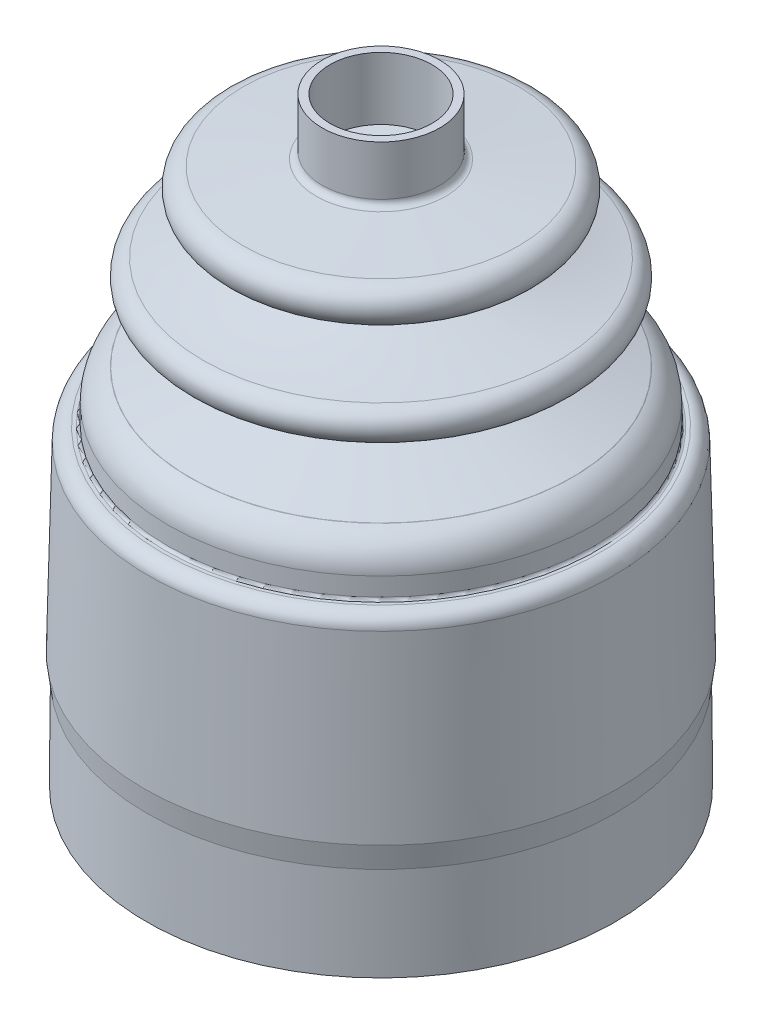
ISO-10303-21;
HEADER;
FILE_DESCRIPTION(('STEP AP214'),'2;1');
FILE_NAME('part.step','',(''),(''),'','','');
FILE_SCHEMA(('AUTOMOTIVE_DESIGN { 1 0 10303 214 1 1 1 1 }'));
ENDSEC;
DATA;
#1=APPLICATION_CONTEXT('core data for automotive mechanical design processes');
#2=APPLICATION_PROTOCOL_DEFINITION('international standard','automotive_design',2000,#1);
#3=PRODUCT_CONTEXT('',#1,'mechanical');
#4=PRODUCT('Part','Part','',(#3));
#5=PRODUCT_RELATED_PRODUCT_CATEGORY('part','',(#4));
#6=PRODUCT_DEFINITION_FORMATION('','',#4);
#7=PRODUCT_DEFINITION_CONTEXT('part definition',#1,'design');
#8=PRODUCT_DEFINITION('design','',#6,#7);
#9=PRODUCT_DEFINITION_SHAPE('','',#8);
#10=(LENGTH_UNIT() NAMED_UNIT(*) SI_UNIT(.MILLI.,.METRE.));
#11=(NAMED_UNIT(*) PLANE_ANGLE_UNIT() SI_UNIT($,.RADIAN.));
#12=(NAMED_UNIT(*) SI_UNIT($,.STERADIAN.) SOLID_ANGLE_UNIT());
#13=UNCERTAINTY_MEASURE_WITH_UNIT(LENGTH_MEASURE(1.E-05),#10,'distance_accuracy_value','');
#14=(GEOMETRIC_REPRESENTATION_CONTEXT(3) GLOBAL_UNCERTAINTY_ASSIGNED_CONTEXT((#13)) GLOBAL_UNIT_ASSIGNED_CONTEXT((#10,
#11,#12)) REPRESENTATION_CONTEXT('',''));
#15=CARTESIAN_POINT('',(0.,0.,0.));
#16=DIRECTION('',(0.,0.,1.));
#17=DIRECTION('',(1.,0.,0.));
#18=AXIS2_PLACEMENT_3D('',#15,#16,#17);
#19=CARTESIAN_POINT('',(0.,12.2776981673296,0.));
#20=DIRECTION('',(0.,-1.,0.));
#21=DIRECTION('',(0.,0.,-1.));
#22=AXIS2_PLACEMENT_3D('',#19,#20,#21);
#23=CONICAL_SURFACE('',#22,18.1982738909813,0.00704074532449117);
#24=CARTESIAN_POINT('',(0.,12.2776981673296,0.));
#25=DIRECTION('',(0.,1.,0.));
#26=DIRECTION('',(0.,0.,-1.));
#27=AXIS2_PLACEMENT_3D('',#24,#25,#26);
#28=CIRCLE('',#27,18.1982738909813);
#29=CARTESIAN_POINT('',(0.,12.2776981673296,-18.1982738909813));
#30=VERTEX_POINT('',#29);
#31=EDGE_CURVE('E10',#30,#30,#28,.T.);
#32=ORIENTED_EDGE('',*,*,#31,.F.);
#33=EDGE_LOOP('',(#32));
#34=FACE_BOUND('',#33,.T.);
#35=CARTESIAN_POINT('',(0.,5.,0.));
#36=DIRECTION('',(0.,1.,0.));
#37=DIRECTION('',(0.,0.,-1.));
#38=AXIS2_PLACEMENT_3D('',#35,#36,#37);
#39=CIRCLE('',#38,18.2495151570411);
#40=CARTESIAN_POINT('',(0.,5.,-18.2495151570411));
#41=VERTEX_POINT('',#40);
#42=EDGE_CURVE('E35',#41,#41,#39,.T.);
#43=ORIENTED_EDGE('',*,*,#42,.T.);
#44=EDGE_LOOP('',(#43));
#45=FACE_BOUND('',#44,.T.);
#46=ADVANCED_FACE('F14',(#34,#45),#23,.T.);
#47=CARTESIAN_POINT('',(0.,12.2776981673296,0.));
#48=DIRECTION('',(0.,1.,0.));
#49=DIRECTION('',(0.,0.,1.));
#50=AXIS2_PLACEMENT_3D('',#47,#48,#49);
#51=CONICAL_SURFACE('',#50,18.1982738909813,0.12689316654883);
#52=CARTESIAN_POINT('',(0.,14.0624647876774,0.));
#53=DIRECTION('',(0.,1.,0.));
#54=DIRECTION('',(0.,0.,1.));
#55=AXIS2_PLACEMENT_3D('',#52,#53,#54);
#56=CIRCLE('',#55,18.4259720151994);
#57=CARTESIAN_POINT('',(0.,14.0624647876774,18.4259720151994));
#58=VERTEX_POINT('',#57);
#59=EDGE_CURVE('E23',#58,#58,#56,.T.);
#60=ORIENTED_EDGE('',*,*,#59,.F.);
#61=EDGE_LOOP('',(#60));
#62=FACE_BOUND('',#61,.T.);
#63=ORIENTED_EDGE('',*,*,#31,.T.);
#64=EDGE_LOOP('',(#63));
#65=FACE_BOUND('',#64,.T.);
#66=ADVANCED_FACE('F206',(#62,#65),#51,.T.);
#67=CARTESIAN_POINT('',(0.,28.2472189532613,0.));
#68=DIRECTION('',(0.,-1.,0.));
#69=DIRECTION('',(0.,0.,-1.));
#70=AXIS2_PLACEMENT_3D('',#67,#68,#69);
#71=CONICAL_SURFACE('',#70,18.0933804091158,0.0234428226888999);
#72=CARTESIAN_POINT('',(0.,28.2472189532613,0.));
#73=DIRECTION('',(0.,1.,0.));
#74=DIRECTION('',(0.,0.,-1.));
#75=AXIS2_PLACEMENT_3D('',#72,#73,#74);
#76=CIRCLE('',#75,18.0933804091158);
#77=CARTESIAN_POINT('',(0.,28.2472189532613,-18.0933804091158));
#78=VERTEX_POINT('',#77);
#79=EDGE_CURVE('E32',#78,#78,#76,.T.);
#80=ORIENTED_EDGE('',*,*,#79,.F.);
#81=EDGE_LOOP('',(#80));
#82=FACE_BOUND('',#81,.T.);
#83=ORIENTED_EDGE('',*,*,#59,.T.);
#84=EDGE_LOOP('',(#83));
#85=FACE_BOUND('',#84,.T.);
#86=ADVANCED_FACE('F212',(#82,#85),#71,.T.);
#87=CARTESIAN_POINT('',(0.,28.2225643305667,0.));
#88=DIRECTION('',(0.,1.,0.));
#89=DIRECTION('',(0.877582561890373,0.,-0.479425538604203));
#90=AXIS2_PLACEMENT_3D('',#87,#88,#89);
#91=TOROIDAL_SURFACE('',#90,17.04188134651,1.05178806281547);
#92=CARTESIAN_POINT('',(0.,29.2743263238211,0.));
#93=DIRECTION('',(0.,1.,0.));
#94=DIRECTION('',(0.,0.,1.));
#95=AXIS2_PLACEMENT_3D('',#92,#93,#94);
#96=CIRCLE('',#95,17.0344760358075);
#97=CARTESIAN_POINT('',(0.,29.2743263238211,17.0344760358075));
#98=VERTEX_POINT('',#97);
#99=EDGE_CURVE('E40',#98,#98,#96,.T.);
#100=ORIENTED_EDGE('',*,*,#99,.F.);
#101=EDGE_LOOP('',(#100));
#102=FACE_BOUND('',#101,.T.);
#103=ORIENTED_EDGE('',*,*,#79,.T.);
#104=EDGE_LOOP('',(#103));
#105=FACE_BOUND('',#104,.T.);
#106=ADVANCED_FACE('F218',(#102,#105),#91,.T.);
#107=CARTESIAN_POINT('',(0.,29.2724684100868,0.));
#108=DIRECTION('',(0.,1.,0.));
#109=DIRECTION('',(0.,0.,1.));
#110=AXIS2_PLACEMENT_3D('',#107,#108,#109);
#111=CONICAL_SURFACE('',#110,16.7706001322913,1.5637555814704);
#112=CARTESIAN_POINT('',(0.,29.2724684100868,0.));
#113=DIRECTION('',(0.,1.,0.));
#114=DIRECTION('',(0.,0.,1.));
#115=AXIS2_PLACEMENT_3D('',#112,#113,#114);
#116=CIRCLE('',#115,16.7706001322913);
#117=CARTESIAN_POINT('',(0.,29.2724684100868,16.7706001322913));
#118=VERTEX_POINT('',#117);
#119=EDGE_CURVE('E44',#118,#118,#116,.T.);
#120=ORIENTED_EDGE('',*,*,#119,.F.);
#121=EDGE_LOOP('',(#120));
#122=FACE_BOUND('',#121,.T.);
#123=ORIENTED_EDGE('',*,*,#99,.T.);
#124=EDGE_LOOP('',(#123));
#125=FACE_BOUND('',#124,.T.);
#126=ADVANCED_FACE('F222',(#122,#125),#111,.F.);
#127=CARTESIAN_POINT('',(0.,29.4791119730205,0.));
#128=DIRECTION('',(0.,1.,0.));
#129=DIRECTION('',(0.877582561890373,0.,-0.479425538604203));
#130=AXIS2_PLACEMENT_3D('',#127,#128,#129);
#131=TOROIDAL_SURFACE('',#130,16.76914518355,0.206648684916626);
#132=CARTESIAN_POINT('',(0.,29.4776570242793,0.));
#133=DIRECTION('',(0.,1.,0.));
#134=DIRECTION('',(0.,0.,1.));
#135=AXIS2_PLACEMENT_3D('',#132,#133,#134);
#136=CIRCLE('',#135,16.5625016206164);
#137=CARTESIAN_POINT('',(0.,29.4776570242793,16.5625016206164));
#138=VERTEX_POINT('',#137);
#139=EDGE_CURVE('E48',#138,#138,#136,.T.);
#140=ORIENTED_EDGE('',*,*,#139,.F.);
#141=EDGE_LOOP('',(#140));
#142=FACE_BOUND('',#141,.T.);
#143=ORIENTED_EDGE('',*,*,#119,.T.);
#144=EDGE_LOOP('',(#143));
#145=FACE_BOUND('',#144,.T.);
#146=ADVANCED_FACE('F226',(#142,#145),#131,.F.);
#147=CARTESIAN_POINT('',(0.,30.880734889159,0.));
#148=DIRECTION('',(0.,-1.,0.));
#149=DIRECTION('',(0.,0.,-1.));
#150=AXIS2_PLACEMENT_3D('',#147,#148,#149);
#151=CONICAL_SURFACE('',#150,16.5526227434599,0.00704074532449139);
#152=CARTESIAN_POINT('',(0.,30.880734889159,0.));
#153=DIRECTION('',(0.,1.,0.));
#154=DIRECTION('',(0.,0.,-1.));
#155=AXIS2_PLACEMENT_3D('',#152,#153,#154);
#156=CIRCLE('',#155,16.5526227434599);
#157=CARTESIAN_POINT('',(0.,30.880734889159,-16.5526227434599));
#158=VERTEX_POINT('',#157);
#159=EDGE_CURVE('E52',#158,#158,#156,.T.);
#160=ORIENTED_EDGE('',*,*,#159,.F.);
#161=EDGE_LOOP('',(#160));
#162=FACE_BOUND('',#161,.T.);
#163=ORIENTED_EDGE('',*,*,#139,.T.);
#164=EDGE_LOOP('',(#163));
#165=FACE_BOUND('',#164,.T.);
#166=ADVANCED_FACE('F230',(#162,#165),#151,.T.);
#167=CARTESIAN_POINT('',(0.,30.8625748783869,0.));
#168=DIRECTION('',(0.,1.,0.));
#169=DIRECTION('',(0.877582561890373,0.,-0.479425538604203));
#170=AXIS2_PLACEMENT_3D('',#167,#168,#169);
#171=TOROIDAL_SURFACE('',#170,13.9733914465066,2.57929522722285);
#172=CARTESIAN_POINT('',(0.,33.2700315877657,0.));
#173=DIRECTION('',(0.,1.,0.));
#174=DIRECTION('',(0.,0.,1.));
#175=AXIS2_PLACEMENT_3D('',#172,#173,#174);
#176=CIRCLE('',#175,14.8990890546062);
#177=CARTESIAN_POINT('',(0.,33.2700315877657,14.8990890546062));
#178=VERTEX_POINT('',#177);
#179=EDGE_CURVE('E56',#178,#178,#176,.T.);
#180=ORIENTED_EDGE('',*,*,#179,.F.);
#181=EDGE_LOOP('',(#180));
#182=FACE_BOUND('',#181,.T.);
#183=ORIENTED_EDGE('',*,*,#159,.T.);
#184=EDGE_LOOP('',(#183));
#185=FACE_BOUND('',#184,.T.);
#186=ADVANCED_FACE('F234',(#182,#185),#171,.T.);
#187=CARTESIAN_POINT('',(0.,33.2786273733319,0.));
#188=DIRECTION('',(0.,-1.,0.));
#189=DIRECTION('',(0.,0.,-1.));
#190=AXIS2_PLACEMENT_3D('',#187,#188,#189);
#191=CONICAL_SURFACE('',#190,14.8767340420701,1.2037119739376);
#192=CARTESIAN_POINT('',(0.,33.2786273733319,0.));
#193=DIRECTION('',(0.,1.,0.));
#194=DIRECTION('',(0.,0.,-1.));
#195=AXIS2_PLACEMENT_3D('',#192,#193,#194);
#196=CIRCLE('',#195,14.8767340420701);
#197=CARTESIAN_POINT('',(0.,33.2786273733319,-14.8767340420701));
#198=VERTEX_POINT('',#197);
#199=EDGE_CURVE('E60',#198,#198,#196,.T.);
#200=ORIENTED_EDGE('',*,*,#199,.F.);
#201=EDGE_LOOP('',(#200));
#202=FACE_BOUND('',#201,.T.);
#203=ORIENTED_EDGE('',*,*,#179,.T.);
#204=EDGE_LOOP('',(#203));
#205=FACE_BOUND('',#204,.T.);
#206=ADVANCED_FACE('F238',(#202,#205),#191,.T.);
#207=CARTESIAN_POINT('',(0.,35.7074769875154,0.));
#208=DIRECTION('',(0.,-1.,0.));
#209=DIRECTION('',(0.,0.,-1.));
#210=AXIS2_PLACEMENT_3D('',#207,#208,#209);
#211=CONICAL_SURFACE('',#210,6.56929194539831,1.28635384120641);
#212=CARTESIAN_POINT('',(0.,35.7074769875154,0.));
#213=DIRECTION('',(0.,1.,0.));
#214=DIRECTION('',(0.,0.,-1.));
#215=AXIS2_PLACEMENT_3D('',#212,#213,#214);
#216=CIRCLE('',#215,6.56929194539831);
#217=CARTESIAN_POINT('',(0.,35.7074769875154,-6.56929194539831));
#218=VERTEX_POINT('',#217);
#219=EDGE_CURVE('E64',#218,#218,#216,.T.);
#220=ORIENTED_EDGE('',*,*,#219,.F.);
#221=EDGE_LOOP('',(#220));
#222=FACE_BOUND('',#221,.T.);
#223=ORIENTED_EDGE('',*,*,#199,.T.);
#224=EDGE_LOOP('',(#223));
#225=FACE_BOUND('',#224,.T.);
#226=ADVANCED_FACE('F242',(#222,#225),#211,.T.);
#227=CARTESIAN_POINT('',(0.,36.0929939641709,0.));
#228=DIRECTION('',(0.,1.,0.));
#229=DIRECTION('',(0.877582561890373,0.,-0.479425538604203));
#230=AXIS2_PLACEMENT_3D('',#227,#228,#229);
#231=TOROIDAL_SURFACE('',#230,6.73772343457958,0.420704772777125);
#232=CARTESIAN_POINT('',(0.,36.3739113034198,0.));
#233=DIRECTION('',(0.,1.,0.));
#234=DIRECTION('',(0.,0.,1.));
#235=AXIS2_PLACEMENT_3D('',#232,#233,#234);
#236=CIRCLE('',#235,6.42454943446661);
#237=CARTESIAN_POINT('',(0.,36.3739113034198,6.42454943446661));
#238=VERTEX_POINT('',#237);
#239=EDGE_CURVE('E68',#238,#238,#236,.T.);
#240=ORIENTED_EDGE('',*,*,#239,.F.);
#241=EDGE_LOOP('',(#240));
#242=FACE_BOUND('',#241,.T.);
#243=ORIENTED_EDGE('',*,*,#219,.T.);
#244=EDGE_LOOP('',(#243));
#245=FACE_BOUND('',#244,.T.);
#246=ADVANCED_FACE('F246',(#242,#245),#231,.F.);
#247=CARTESIAN_POINT('',(0.,36.3739113034198,0.));
#248=DIRECTION('',(0.,1.,0.));
#249=DIRECTION('',(0.,0.,1.));
#250=AXIS2_PLACEMENT_3D('',#247,#248,#249);
#251=CONICAL_SURFACE('',#250,6.42454943446661,1.34123546924363);
#252=CARTESIAN_POINT('',(0.,38.1221713633607,0.));
#253=DIRECTION('',(0.,1.,0.));
#254=DIRECTION('',(0.,0.,1.));
#255=AXIS2_PLACEMENT_3D('',#252,#253,#254);
#256=CIRCLE('',#255,13.9059711263529);
#257=CARTESIAN_POINT('',(0.,38.1221713633607,13.9059711263529));
#258=VERTEX_POINT('',#257);
#259=EDGE_CURVE('E72',#258,#258,#256,.T.);
#260=ORIENTED_EDGE('',*,*,#259,.F.);
#261=EDGE_LOOP('',(#260));
#262=FACE_BOUND('',#261,.T.);
#263=ORIENTED_EDGE('',*,*,#239,.T.);
#264=EDGE_LOOP('',(#263));
#265=FACE_BOUND('',#264,.T.);
#266=ADVANCED_FACE('F250',(#262,#265),#251,.T.);
#267=CARTESIAN_POINT('',(0.,39.3730692964758,0.));
#268=DIRECTION('',(0.,1.,0.));
#269=DIRECTION('',(0.877582561890373,0.,-0.479425538604203));
#270=AXIS2_PLACEMENT_3D('',#267,#268,#269);
#271=TOROIDAL_SURFACE('',#270,13.6136610567441,1.28459753069446);
#272=CARTESIAN_POINT('',(0.,40.6375515722566,0.));
#273=DIRECTION('',(0.,1.,0.));
#274=DIRECTION('',(0.,0.,1.));
#275=AXIS2_PLACEMENT_3D('',#272,#273,#274);
#276=CIRCLE('',#275,13.8401017556092);
#277=CARTESIAN_POINT('',(0.,40.6375515722566,13.8401017556092));
#278=VERTEX_POINT('',#277);
#279=EDGE_CURVE('E76',#278,#278,#276,.T.);
#280=ORIENTED_EDGE('',*,*,#279,.F.);
#281=EDGE_LOOP('',(#280));
#282=FACE_BOUND('',#281,.T.);
#283=ORIENTED_EDGE('',*,*,#259,.T.);
#284=EDGE_LOOP('',(#283));
#285=FACE_BOUND('',#284,.T.);
#286=ADVANCED_FACE('F254',(#282,#285),#271,.T.);
#287=CARTESIAN_POINT('',(0.,77.7364617164502,0.));
#288=DIRECTION('',(0.,1.,0.));
#289=DIRECTION('',(0.877582561890373,0.,-0.479425538604203));
#290=AXIS2_PLACEMENT_3D('',#287,#288,#289);
#291=DEGENERATE_TOROIDAL_SURFACE('',#290,20.4836928134576,37.6890758182112,.T.);
#292=CARTESIAN_POINT('',(0.,42.654961299703,0.));
#293=DIRECTION('',(0.,1.,0.));
#294=DIRECTION('',(0.,0.,1.));
#295=AXIS2_PLACEMENT_3D('',#292,#293,#294);
#296=CIRCLE('',#295,6.70854255871855);
#297=CARTESIAN_POINT('',(0.,42.654961299703,6.70854255871855));
#298=VERTEX_POINT('',#297);
#299=EDGE_CURVE('E80',#298,#298,#296,.T.);
#300=ORIENTED_EDGE('',*,*,#299,.F.);
#301=EDGE_LOOP('',(#300));
#302=FACE_BOUND('',#301,.T.);
#303=ORIENTED_EDGE('',*,*,#279,.T.);
#304=EDGE_LOOP('',(#303));
#305=FACE_BOUND('',#304,.T.);
#306=ADVANCED_FACE('F258',(#302,#305),#291,.F.);
#307=CARTESIAN_POINT('',(0.,43.0465589799618,0.));
#308=DIRECTION('',(0.,1.,0.));
#309=DIRECTION('',(0.877582561890373,0.,-0.479425538604203));
#310=AXIS2_PLACEMENT_3D('',#307,#308,#309);
#311=TOROIDAL_SURFACE('',#310,6.86230784301061,0.420704772777221);
#312=CARTESIAN_POINT('',(0.,43.4044139908009,0.));
#313=DIRECTION('',(0.,1.,0.));
#314=DIRECTION('',(0.,0.,1.));
#315=AXIS2_PLACEMENT_3D('',#312,#313,#314);
#316=CIRCLE('',#315,6.64110138502416);
#317=CARTESIAN_POINT('',(0.,43.4044139908009,6.64110138502416));
#318=VERTEX_POINT('',#317);
#319=EDGE_CURVE('E84',#318,#318,#316,.T.);
#320=ORIENTED_EDGE('',*,*,#319,.F.);
#321=EDGE_LOOP('',(#320));
#322=FACE_BOUND('',#321,.T.);
#323=ORIENTED_EDGE('',*,*,#299,.T.);
#324=EDGE_LOOP('',(#323));
#325=FACE_BOUND('',#324,.T.);
#326=ADVANCED_FACE('F262',(#322,#325),#311,.F.);
#327=CARTESIAN_POINT('',(0.,43.4044139908009,0.));
#328=DIRECTION('',(0.,1.,0.));
#329=DIRECTION('',(0.,0.,1.));
#330=AXIS2_PLACEMENT_3D('',#327,#328,#329);
#331=CONICAL_SURFACE('',#330,6.64110138502415,1.4422159932332);
#332=CARTESIAN_POINT('',(0.,43.9413410673626,0.));
#333=DIRECTION('',(0.,1.,0.));
#334=DIRECTION('',(0.,0.,1.));
#335=AXIS2_PLACEMENT_3D('',#332,#333,#334);
#336=CIRCLE('',#335,10.793873489738);
#337=CARTESIAN_POINT('',(0.,43.9413410673626,10.793873489738));
#338=VERTEX_POINT('',#337);
#339=EDGE_CURVE('E88',#338,#338,#336,.T.);
#340=ORIENTED_EDGE('',*,*,#339,.F.);
#341=EDGE_LOOP('',(#340));
#342=FACE_BOUND('',#341,.T.);
#343=ORIENTED_EDGE('',*,*,#319,.T.);
#344=EDGE_LOOP('',(#343));
#345=FACE_BOUND('',#344,.T.);
#346=ADVANCED_FACE('F266',(#342,#345),#331,.T.);
#347=CARTESIAN_POINT('',(0.,45.3676549490572,0.));
#348=DIRECTION('',(0.,1.,0.));
#349=DIRECTION('',(0.877582561890373,0.,-0.479425538604203));
#350=AXIS2_PLACEMENT_3D('',#347,#348,#349);
#351=TOROIDAL_SURFACE('',#350,10.6094601572827,1.43818620710325);
#352=CARTESIAN_POINT('',(0.,46.8009164389899,0.));
#353=DIRECTION('',(0.,1.,0.));
#354=DIRECTION('',(0.,0.,1.));
#355=AXIS2_PLACEMENT_3D('',#352,#353,#354);
#356=CIRCLE('',#355,10.7283763789598);
#357=CARTESIAN_POINT('',(0.,46.8009164389899,10.7283763789598));
#358=VERTEX_POINT('',#357);
#359=EDGE_CURVE('E92',#358,#358,#356,.T.);
#360=ORIENTED_EDGE('',*,*,#359,.F.);
#361=EDGE_LOOP('',(#360));
#362=FACE_BOUND('',#361,.T.);
#363=ORIENTED_EDGE('',*,*,#339,.T.);
#364=EDGE_LOOP('',(#363));
#365=FACE_BOUND('',#364,.T.);
#366=ADVANCED_FACE('F270',(#362,#365),#351,.T.);
#367=CARTESIAN_POINT('',(0.,783.127214234975,0.));
#368=DIRECTION('',(0.,1.,0.));
#369=DIRECTION('',(0.877582561890373,0.,-0.479425538604203));
#370=AXIS2_PLACEMENT_3D('',#367,#368,#369);
#371=DEGENERATE_TOROIDAL_SURFACE('',#370,71.8206068415554,738.856330722582,.T.);
#372=CARTESIAN_POINT('',(0.,47.2949774496061,0.));
#373=DIRECTION('',(0.,1.,0.));
#374=DIRECTION('',(0.,0.,1.));
#375=AXIS2_PLACEMENT_3D('',#372,#373,#374);
#376=CIRCLE('',#375,5.04039453074171);
#377=CARTESIAN_POINT('',(0.,47.2949774496061,5.04039453074171));
#378=VERTEX_POINT('',#377);
#379=EDGE_CURVE('E96',#378,#378,#376,.T.);
#380=ORIENTED_EDGE('',*,*,#379,.F.);
#381=EDGE_LOOP('',(#380));
#382=FACE_BOUND('',#381,.T.);
#383=ORIENTED_EDGE('',*,*,#359,.T.);
#384=EDGE_LOOP('',(#383));
#385=FACE_BOUND('',#384,.T.);
#386=ADVANCED_FACE('F274',(#382,#385),#371,.F.);
#387=CARTESIAN_POINT('',(0.,47.8039282768298,0.));
#388=DIRECTION('',(0.,1.,0.));
#389=DIRECTION('',(0.877582561890373,0.,-0.479425538604203));
#390=AXIS2_PLACEMENT_3D('',#387,#388,#389);
#391=TOROIDAL_SURFACE('',#390,5.08658419544834,0.511042493005759);
#392=CARTESIAN_POINT('',(0.,47.8039282768298,0.));
#393=DIRECTION('',(0.,1.,0.));
#394=DIRECTION('',(0.,0.,1.));
#395=AXIS2_PLACEMENT_3D('',#392,#393,#394);
#396=CIRCLE('',#395,4.57554170244258);
#397=CARTESIAN_POINT('',(0.,47.8039282768298,4.57554170244258));
#398=VERTEX_POINT('',#397);
#399=EDGE_CURVE('E100',#398,#398,#396,.T.);
#400=ORIENTED_EDGE('',*,*,#399,.F.);
#401=EDGE_LOOP('',(#400));
#402=FACE_BOUND('',#401,.T.);
#403=ORIENTED_EDGE('',*,*,#379,.T.);
#404=EDGE_LOOP('',(#403));
#405=FACE_BOUND('',#404,.T.);
#406=ADVANCED_FACE('F278',(#402,#405),#391,.F.);
#407=CARTESIAN_POINT('',(0.,28.335994720459,0.));
#408=DIRECTION('',(0.,1.,0.));
#409=DIRECTION('',(0.,0.,1.));
#410=AXIS2_PLACEMENT_3D('',#407,#408,#409);
#411=CYLINDRICAL_SURFACE('',#410,4.57554170244258);
#412=CARTESIAN_POINT('',(0.,51.6719894409422,0.));
#413=DIRECTION('',(0.,1.,0.));
#414=DIRECTION('',(0.,0.,1.));
#415=AXIS2_PLACEMENT_3D('',#412,#413,#414);
#416=CIRCLE('',#415,4.57554170244258);
#417=CARTESIAN_POINT('',(0.,51.6719894409422,4.57554170244258));
#418=VERTEX_POINT('',#417);
#419=EDGE_CURVE('E104',#418,#418,#416,.T.);
#420=ORIENTED_EDGE('',*,*,#419,.F.);
#421=EDGE_LOOP('',(#420));
#422=FACE_BOUND('',#421,.T.);
#423=ORIENTED_EDGE('',*,*,#399,.T.);
#424=EDGE_LOOP('',(#423));
#425=FACE_BOUND('',#424,.T.);
#426=ADVANCED_FACE('F282',(#422,#425),#411,.T.);
#427=CARTESIAN_POINT('',(0.,28.335994720459,0.));
#428=DIRECTION('',(0.,1.,0.));
#429=DIRECTION('',(0.,0.,1.));
#430=AXIS2_PLACEMENT_3D('',#427,#428,#429);
#431=CYLINDRICAL_SURFACE('',#430,3.969);
#432=CARTESIAN_POINT('',(0.,46.8122429082888,0.));
#433=DIRECTION('',(0.,1.,0.));
#434=DIRECTION('',(0.,0.,1.));
#435=AXIS2_PLACEMENT_3D('',#432,#433,#434);
#436=CIRCLE('',#435,3.969);
#437=CARTESIAN_POINT('',(0.,46.8122429082888,3.969));
#438=VERTEX_POINT('',#437);
#439=EDGE_CURVE('E108',#438,#438,#436,.T.);
#440=ORIENTED_EDGE('',*,*,#439,.F.);
#441=EDGE_LOOP('',(#440));
#442=FACE_BOUND('',#441,.T.);
#443=CARTESIAN_POINT('',(0.,51.6719894409422,0.));
#444=DIRECTION('',(0.,1.,0.));
#445=DIRECTION('',(0.,0.,1.));
#446=AXIS2_PLACEMENT_3D('',#443,#444,#445);
#447=CIRCLE('',#446,3.969);
#448=CARTESIAN_POINT('',(0.,51.6719894409422,3.969));
#449=VERTEX_POINT('',#448);
#450=EDGE_CURVE('E109',#449,#449,#447,.T.);
#451=ORIENTED_EDGE('',*,*,#450,.T.);
#452=EDGE_LOOP('',(#451));
#453=FACE_BOUND('',#452,.T.);
#454=ADVANCED_FACE('F286',(#442,#453),#431,.F.);
#455=CARTESIAN_POINT('',(0.,782.635632959667,0.));
#456=DIRECTION('',(0.,1.,0.));
#457=DIRECTION('',(0.877582561890373,0.,-0.479425538604203));
#458=AXIS2_PLACEMENT_3D('',#455,#456,#457);
#459=DEGENERATE_TOROIDAL_SURFACE('',#458,76.9688875139177,739.435625949805,.T.);
#460=CARTESIAN_POINT('',(0.,46.18075696739,0.));
#461=DIRECTION('',(0.,1.,0.));
#462=DIRECTION('',(0.,0.,1.));
#463=AXIS2_PLACEMENT_3D('',#460,#461,#462);
#464=CIRCLE('',#463,10.6419657477188);
#465=CARTESIAN_POINT('',(0.,46.18075696739,10.6419657477188));
#466=VERTEX_POINT('',#465);
#467=EDGE_CURVE('E117',#466,#466,#464,.T.);
#468=ORIENTED_EDGE('',*,*,#467,.F.);
#469=EDGE_LOOP('',(#468));
#470=FACE_BOUND('',#469,.T.);
#471=ORIENTED_EDGE('',*,*,#439,.T.);
#472=EDGE_LOOP('',(#471));
#473=FACE_BOUND('',#472,.T.);
#474=ADVANCED_FACE('F290',(#470,#473),#459,.T.);
#475=CARTESIAN_POINT('',(0.,45.3253282757217,0.));
#476=DIRECTION('',(0.,1.,0.));
#477=DIRECTION('',(0.877582561890373,0.,-0.479425538604203));
#478=AXIS2_PLACEMENT_3D('',#475,#476,#477);
#479=TOROIDAL_SURFACE('',#478,10.5649237540347,0.858890979880471);
#480=CARTESIAN_POINT('',(0.,44.4727732042393,0.));
#481=DIRECTION('',(0.,1.,0.));
#482=DIRECTION('',(0.,0.,1.));
#483=AXIS2_PLACEMENT_3D('',#480,#481,#482);
#484=CIRCLE('',#483,10.669056195712);
#485=CARTESIAN_POINT('',(0.,44.4727732042393,10.669056195712));
#486=VERTEX_POINT('',#485);
#487=EDGE_CURVE('E121',#486,#486,#484,.T.);
#488=ORIENTED_EDGE('',*,*,#487,.F.);
#489=EDGE_LOOP('',(#488));
#490=FACE_BOUND('',#489,.T.);
#491=ORIENTED_EDGE('',*,*,#467,.T.);
#492=EDGE_LOOP('',(#491));
#493=FACE_BOUND('',#492,.T.);
#494=ADVANCED_FACE('F294',(#490,#493),#479,.F.);
#495=CARTESIAN_POINT('',(0.,43.953268047751,0.));
#496=DIRECTION('',(0.,1.,0.));
#497=DIRECTION('',(0.,0.,1.));
#498=AXIS2_PLACEMENT_3D('',#495,#496,#497);
#499=CONICAL_SURFACE('',#498,6.41575387521237,1.44925673855771);
#500=CARTESIAN_POINT('',(0.,43.953268047751,0.));
#501=DIRECTION('',(0.,1.,0.));
#502=DIRECTION('',(0.,0.,1.));
#503=AXIS2_PLACEMENT_3D('',#500,#501,#502);
#504=CIRCLE('',#503,6.41575387521237);
#505=CARTESIAN_POINT('',(0.,43.953268047751,6.41575387521237));
#506=VERTEX_POINT('',#505);
#507=EDGE_CURVE('E125',#506,#506,#504,.T.);
#508=ORIENTED_EDGE('',*,*,#507,.F.);
#509=EDGE_LOOP('',(#508));
#510=FACE_BOUND('',#509,.T.);
#511=ORIENTED_EDGE('',*,*,#487,.T.);
#512=EDGE_LOOP('',(#511));
#513=FACE_BOUND('',#512,.T.);
#514=ADVANCED_FACE('F298',(#510,#513),#499,.F.);
#515=CARTESIAN_POINT('',(0.,43.0306723643459,0.));
#516=DIRECTION('',(0.,1.,0.));
#517=DIRECTION('',(0.877582561890373,0.,-0.479425538604203));
#518=AXIS2_PLACEMENT_3D('',#515,#516,#517);
#519=TOROIDAL_SURFACE('',#518,6.80152220590114,1.);
#520=CARTESIAN_POINT('',(0.,42.1024552721066,0.));
#521=DIRECTION('',(0.,1.,0.));
#522=DIRECTION('',(0.,0.,1.));
#523=AXIS2_PLACEMENT_3D('',#520,#521,#522);
#524=CIRCLE('',#523,6.42948318956711);
#525=CARTESIAN_POINT('',(0.,42.1024552721066,6.42948318956711));
#526=VERTEX_POINT('',#525);
#527=EDGE_CURVE('E129',#526,#526,#524,.T.);
#528=ORIENTED_EDGE('',*,*,#527,.F.);
#529=EDGE_LOOP('',(#528));
#530=FACE_BOUND('',#529,.T.);
#531=ORIENTED_EDGE('',*,*,#507,.T.);
#532=EDGE_LOOP('',(#531));
#533=FACE_BOUND('',#532,.T.);
#534=ADVANCED_FACE('F302',(#530,#533),#519,.T.);
#535=CARTESIAN_POINT('',(0.,77.623811368635,0.));
#536=DIRECTION('',(0.,1.,0.));
#537=DIRECTION('',(0.877582561890373,0.,-0.479425538604203));
#538=AXIS2_PLACEMENT_3D('',#535,#536,#537);
#539=DEGENERATE_TOROIDAL_SURFACE('',#538,20.6668103100164,38.2683710454346,.T.);
#540=CARTESIAN_POINT('',(0.,40.0031051323701,0.));
#541=DIRECTION('',(0.,1.,0.));
#542=DIRECTION('',(0.,0.,1.));
#543=AXIS2_PLACEMENT_3D('',#540,#541,#542);
#544=CIRCLE('',#543,13.6560553752239);
#545=CARTESIAN_POINT('',(0.,40.0031051323701,13.6560553752239));
#546=VERTEX_POINT('',#545);
#547=EDGE_CURVE('E133',#546,#546,#544,.T.);
#548=ORIENTED_EDGE('',*,*,#547,.F.);
#549=EDGE_LOOP('',(#548));
#550=FACE_BOUND('',#549,.T.);
#551=ORIENTED_EDGE('',*,*,#527,.T.);
#552=EDGE_LOOP('',(#551));
#553=FACE_BOUND('',#552,.T.);
#554=ADVANCED_FACE('F306',(#550,#553),#539,.T.);
#555=CARTESIAN_POINT('',(0.,39.3097395659295,0.));
#556=DIRECTION('',(0.,1.,0.));
#557=DIRECTION('',(0.877582561890373,0.,-0.479425538604203));
#558=AXIS2_PLACEMENT_3D('',#555,#556,#557);
#559=TOROIDAL_SURFACE('',#558,13.526844189341,0.705302303471867);
#560=CARTESIAN_POINT('',(0.,38.6218269225165,0.));
#561=DIRECTION('',(0.,1.,0.));
#562=DIRECTION('',(0.,0.,1.));
#563=AXIS2_PLACEMENT_3D('',#560,#561,#562);
#564=CIRCLE('',#563,13.6824961546842);
#565=CARTESIAN_POINT('',(0.,38.6218269225165,13.6824961546842));
#566=VERTEX_POINT('',#565);
#567=EDGE_CURVE('E137',#566,#566,#564,.T.);
#568=ORIENTED_EDGE('',*,*,#567,.F.);
#569=EDGE_LOOP('',(#568));
#570=FACE_BOUND('',#569,.T.);
#571=ORIENTED_EDGE('',*,*,#547,.T.);
#572=EDGE_LOOP('',(#571));
#573=FACE_BOUND('',#572,.T.);
#574=ADVANCED_FACE('F310',(#570,#573),#559,.F.);
#575=CARTESIAN_POINT('',(0.,36.8951451893716,0.));
#576=DIRECTION('',(0.,1.,0.));
#577=DIRECTION('',(0.,0.,1.));
#578=AXIS2_PLACEMENT_3D('',#575,#576,#577);
#579=CONICAL_SURFACE('',#578,6.05132880798255,1.34827621456746);
#580=CARTESIAN_POINT('',(0.,36.8951451893716,0.));
#581=DIRECTION('',(0.,1.,0.));
#582=DIRECTION('',(0.,0.,1.));
#583=AXIS2_PLACEMENT_3D('',#580,#581,#582);
#584=CIRCLE('',#583,6.05132880798255);
#585=CARTESIAN_POINT('',(0.,36.8951451893716,6.05132880798255));
#586=VERTEX_POINT('',#585);
#587=EDGE_CURVE('E141',#586,#586,#584,.T.);
#588=ORIENTED_EDGE('',*,*,#587,.F.);
#589=EDGE_LOOP('',(#588));
#590=FACE_BOUND('',#589,.T.);
#591=ORIENTED_EDGE('',*,*,#567,.T.);
#592=EDGE_LOOP('',(#591));
#593=FACE_BOUND('',#592,.T.);
#594=ADVANCED_FACE('F314',(#590,#593),#579,.F.);
#595=CARTESIAN_POINT('',(0.,36.0781568590784,0.));
#596=DIRECTION('',(0.,1.,0.));
#597=DIRECTION('',(0.877582561890373,0.,-0.479425538604203));
#598=AXIS2_PLACEMENT_3D('',#595,#596,#597);
#599=TOROIDAL_SURFACE('',#598,6.62798300953213,1.);
#600=CARTESIAN_POINT('',(0.,35.1473291408352,0.));
#601=DIRECTION('',(0.,1.,0.));
#602=DIRECTION('',(0.,0.,1.));
#603=AXIS2_PLACEMENT_3D('',#600,#601,#602);
#604=CIRCLE('',#603,6.26252472333515);
#605=CARTESIAN_POINT('',(0.,35.1473291408352,6.26252472333515));
#606=VERTEX_POINT('',#605);
#607=EDGE_CURVE('E145',#606,#606,#604,.T.);
#608=ORIENTED_EDGE('',*,*,#607,.F.);
#609=EDGE_LOOP('',(#608));
#610=FACE_BOUND('',#609,.T.);
#611=ORIENTED_EDGE('',*,*,#587,.T.);
#612=EDGE_LOOP('',(#611));
#613=FACE_BOUND('',#612,.T.);
#614=ADVANCED_FACE('F318',(#610,#613),#599,.T.);
#615=CARTESIAN_POINT('',(0.,35.1473291408352,0.));
#616=DIRECTION('',(0.,-1.,0.));
#617=DIRECTION('',(0.,0.,-1.));
#618=AXIS2_PLACEMENT_3D('',#615,#616,#617);
#619=CONICAL_SURFACE('',#618,6.26252472333513,1.27931309588192);
#620=CARTESIAN_POINT('',(0.,32.6585787764717,0.));
#621=DIRECTION('',(0.,1.,0.));
#622=DIRECTION('',(0.,0.,-1.));
#623=AXIS2_PLACEMENT_3D('',#620,#621,#622);
#624=CIRCLE('',#623,14.5575625067655);
#625=CARTESIAN_POINT('',(0.,32.6585787764717,-14.5575625067655));
#626=VERTEX_POINT('',#625);
#627=EDGE_CURVE('E149',#626,#626,#624,.T.);
#628=ORIENTED_EDGE('',*,*,#627,.F.);
#629=EDGE_LOOP('',(#628));
#630=FACE_BOUND('',#629,.T.);
#631=ORIENTED_EDGE('',*,*,#607,.T.);
#632=EDGE_LOOP('',(#631));
#633=FACE_BOUND('',#632,.T.);
#634=ADVANCED_FACE('F322',(#630,#633),#619,.F.);
#635=CARTESIAN_POINT('',(0.,30.7969233399852,0.));
#636=DIRECTION('',(0.,1.,0.));
#637=DIRECTION('',(0.877582561890373,0.,-0.479425538604203));
#638=AXIS2_PLACEMENT_3D('',#635,#636,#637);
#639=TOROIDAL_SURFACE('',#638,13.8266459343716,2.);
#640=CARTESIAN_POINT('',(0.,30.796923339985,0.));
#641=DIRECTION('',(0.,1.,0.));
#642=DIRECTION('',(0.,0.,1.));
#643=AXIS2_PLACEMENT_3D('',#640,#641,#642);
#644=CIRCLE('',#643,15.8266459343716);
#645=CARTESIAN_POINT('',(0.,30.796923339985,15.8266459343716));
#646=VERTEX_POINT('',#645);
#647=EDGE_CURVE('E153',#646,#646,#644,.T.);
#648=ORIENTED_EDGE('',*,*,#647,.F.);
#649=EDGE_LOOP('',(#648));
#650=FACE_BOUND('',#649,.T.);
#651=ORIENTED_EDGE('',*,*,#627,.T.);
#652=EDGE_LOOP('',(#651));
#653=FACE_BOUND('',#652,.T.);
#654=ADVANCED_FACE('F326',(#650,#653),#639,.F.);
#655=CARTESIAN_POINT('',(0.,28.335994720459,0.));
#656=DIRECTION('',(0.,1.,0.));
#657=DIRECTION('',(0.,0.,1.));
#658=AXIS2_PLACEMENT_3D('',#655,#656,#657);
#659=CYLINDRICAL_SURFACE('',#658,15.8266459343716);
#660=CARTESIAN_POINT('',(0.,29.3938106976324,0.));
#661=DIRECTION('',(0.,1.,0.));
#662=DIRECTION('',(0.,0.,1.));
#663=AXIS2_PLACEMENT_3D('',#660,#661,#662);
#664=CIRCLE('',#663,15.8266459343716);
#665=CARTESIAN_POINT('',(0.,29.3938106976324,15.8266459343716));
#666=VERTEX_POINT('',#665);
#667=EDGE_CURVE('E157',#666,#666,#664,.T.);
#668=ORIENTED_EDGE('',*,*,#667,.F.);
#669=EDGE_LOOP('',(#668));
#670=FACE_BOUND('',#669,.T.);
#671=ORIENTED_EDGE('',*,*,#647,.T.);
#672=EDGE_LOOP('',(#671));
#673=FACE_BOUND('',#672,.T.);
#674=ADVANCED_FACE('F330',(#670,#673),#659,.F.);
#675=CARTESIAN_POINT('',(0.,29.3938106976783,0.));
#676=DIRECTION('',(0.,1.,0.));
#677=DIRECTION('',(0.877582561890373,0.,-0.479425538604203));
#678=AXIS2_PLACEMENT_3D('',#675,#676,#677);
#679=TOROIDAL_SURFACE('',#678,16.612589846513,0.78594391213948);
#680=CARTESIAN_POINT('',(0.,28.6078667855388,0.));
#681=DIRECTION('',(0.,1.,0.));
#682=DIRECTION('',(0.,0.,1.));
#683=AXIS2_PLACEMENT_3D('',#680,#681,#682);
#684=CIRCLE('',#683,16.612589846513);
#685=CARTESIAN_POINT('',(0.,28.6078667855388,16.612589846513));
#686=VERTEX_POINT('',#685);
#687=EDGE_CURVE('E161',#686,#686,#684,.T.);
#688=ORIENTED_EDGE('',*,*,#687,.F.);
#689=EDGE_LOOP('',(#688));
#690=FACE_BOUND('',#689,.T.);
#691=ORIENTED_EDGE('',*,*,#667,.T.);
#692=EDGE_LOOP('',(#691));
#693=FACE_BOUND('',#692,.T.);
#694=ADVANCED_FACE('F334',(#690,#693),#679,.T.);
#695=CARTESIAN_POINT('',(0.,28.1353739499462,0.));
#696=DIRECTION('',(0.,1.,0.));
#697=DIRECTION('',(0.877582561890373,0.,-0.479425538604203));
#698=AXIS2_PLACEMENT_3D('',#695,#696,#697);
#699=TOROIDAL_SURFACE('',#698,16.8955733096614,0.472492835592689);
#700=CARTESIAN_POINT('',(0.,28.1431234665058,0.));
#701=DIRECTION('',(0.,1.,0.));
#702=DIRECTION('',(0.,0.,1.));
#703=AXIS2_PLACEMENT_3D('',#700,#701,#702);
#704=CIRCLE('',#703,17.3680025897441);
#705=CARTESIAN_POINT('',(0.,28.1431234665058,17.3680025897441));
#706=VERTEX_POINT('',#705);
#707=EDGE_CURVE('E165',#706,#706,#704,.T.);
#708=ORIENTED_EDGE('',*,*,#707,.F.);
#709=EDGE_LOOP('',(#708));
#710=FACE_BOUND('',#709,.T.);
#711=CARTESIAN_POINT('',(0.,28.6078667855388,0.));
#712=DIRECTION('',(0.,1.,0.));
#713=DIRECTION('',(0.,0.,1.));
#714=AXIS2_PLACEMENT_3D('',#711,#712,#713);
#715=CIRCLE('',#714,16.8955733096613);
#716=CARTESIAN_POINT('',(0.,28.6078667855388,16.8955733096613));
#717=VERTEX_POINT('',#716);
#718=EDGE_CURVE('E113',#717,#717,#715,.T.);
#719=ORIENTED_EDGE('',*,*,#718,.T.);
#720=EDGE_LOOP('',(#719));
#721=FACE_BOUND('',#720,.T.);
#722=ADVANCED_FACE('F338',(#710,#721),#699,.F.);
#723=CARTESIAN_POINT('',(0.,28.1431234665058,0.));
#724=DIRECTION('',(0.,-1.,0.));
#725=DIRECTION('',(0.,0.,-1.));
#726=AXIS2_PLACEMENT_3D('',#723,#724,#725);
#727=CONICAL_SURFACE('',#726,17.3680025897441,0.0164020773644087);
#728=CARTESIAN_POINT('',(0.,13.9999999999999,0.));
#729=DIRECTION('',(0.,1.,0.));
#730=DIRECTION('',(0.,0.,-1.));
#731=AXIS2_PLACEMENT_3D('',#728,#729,#730);
#732=CIRCLE('',#731,17.6);
#733=CARTESIAN_POINT('',(0.,13.9999999999999,-17.6));
#734=VERTEX_POINT('',#733);
#735=EDGE_CURVE('E172',#734,#734,#732,.T.);
#736=ORIENTED_EDGE('',*,*,#735,.F.);
#737=EDGE_LOOP('',(#736));
#738=FACE_BOUND('',#737,.T.);
#739=ORIENTED_EDGE('',*,*,#707,.T.);
#740=EDGE_LOOP('',(#739));
#741=FACE_BOUND('',#740,.T.);
#742=ADVANCED_FACE('F342',(#738,#741),#727,.F.);
#743=CARTESIAN_POINT('',(0.,12.2216129302979,0.));
#744=DIRECTION('',(0.,1.,0.));
#745=DIRECTION('',(0.,0.,1.));
#746=AXIS2_PLACEMENT_3D('',#743,#744,#745);
#747=CONICAL_SURFACE('',#746,17.3603791502186,0.133933911873322);
#748=CARTESIAN_POINT('',(0.,12.2216129302979,0.));
#749=DIRECTION('',(0.,1.,0.));
#750=DIRECTION('',(0.,0.,1.));
#751=AXIS2_PLACEMENT_3D('',#748,#749,#750);
#752=CIRCLE('',#751,17.3603791502186);
#753=CARTESIAN_POINT('',(0.,12.2216129302979,17.3603791502186));
#754=VERTEX_POINT('',#753);
#755=EDGE_CURVE('E175',#754,#754,#752,.T.);
#756=ORIENTED_EDGE('',*,*,#755,.F.);
#757=EDGE_LOOP('',(#756));
#758=FACE_BOUND('',#757,.T.);
#759=ORIENTED_EDGE('',*,*,#735,.T.);
#760=EDGE_LOOP('',(#759));
#761=FACE_BOUND('',#760,.T.);
#762=ADVANCED_FACE('F202',(#758,#761),#747,.F.);
#763=CARTESIAN_POINT('',(0.,28.335994720459,0.));
#764=DIRECTION('',(0.,1.,0.));
#765=DIRECTION('',(0.,0.,1.));
#766=AXIS2_PLACEMENT_3D('',#763,#764,#765);
#767=CYLINDRICAL_SURFACE('',#766,17.3603791502186);
#768=CARTESIAN_POINT('',(0.,5.,0.));
#769=DIRECTION('',(0.,1.,0.));
#770=DIRECTION('',(0.,0.,1.));
#771=AXIS2_PLACEMENT_3D('',#768,#769,#770);
#772=CIRCLE('',#771,17.3603791502186);
#773=CARTESIAN_POINT('',(0.,5.,17.3603791502186));
#774=VERTEX_POINT('',#773);
#775=EDGE_CURVE('E18',#774,#774,#772,.T.);
#776=ORIENTED_EDGE('',*,*,#775,.F.);
#777=EDGE_LOOP('',(#776));
#778=FACE_BOUND('',#777,.T.);
#779=ORIENTED_EDGE('',*,*,#755,.T.);
#780=EDGE_LOOP('',(#779));
#781=FACE_BOUND('',#780,.T.);
#782=ADVANCED_FACE('F194',(#778,#781),#767,.F.);
#783=CARTESIAN_POINT('',(17.3603791502186,5.,0.));
#784=DIRECTION('',(0.,1.,0.));
#785=DIRECTION('',(0.,0.,1.));
#786=AXIS2_PLACEMENT_3D('',#783,#784,#785);
#787=PLANE('',#786);
#788=ORIENTED_EDGE('',*,*,#42,.F.);
#789=EDGE_LOOP('',(#788));
#790=FACE_BOUND('',#789,.T.);
#791=ORIENTED_EDGE('',*,*,#775,.T.);
#792=EDGE_LOOP('',(#791));
#793=FACE_BOUND('',#792,.T.);
#794=ADVANCED_FACE('F191',(#790,#793),#787,.F.);
#795=CARTESIAN_POINT('',(3.969,51.6719894409422,0.));
#796=DIRECTION('',(0.,1.,0.));
#797=DIRECTION('',(0.,0.,1.));
#798=AXIS2_PLACEMENT_3D('',#795,#796,#797);
#799=PLANE('',#798);
#800=ORIENTED_EDGE('',*,*,#419,.T.);
#801=EDGE_LOOP('',(#800));
#802=FACE_BOUND('',#801,.T.);
#803=ORIENTED_EDGE('',*,*,#450,.F.);
#804=EDGE_LOOP('',(#803));
#805=FACE_BOUND('',#804,.T.);
#806=ADVANCED_FACE('F193',(#802,#805),#799,.T.);
#807=CARTESIAN_POINT('',(16.8955733096614,28.6078667855388,0.));
#808=DIRECTION('',(0.,1.,0.));
#809=DIRECTION('',(0.,0.,1.));
#810=AXIS2_PLACEMENT_3D('',#807,#808,#809);
#811=PLANE('',#810);
#812=ORIENTED_EDGE('',*,*,#718,.F.);
#813=EDGE_LOOP('',(#812));
#814=FACE_BOUND('',#813,.T.);
#815=ORIENTED_EDGE('',*,*,#687,.T.);
#816=EDGE_LOOP('',(#815));
#817=FACE_BOUND('',#816,.T.);
#818=ADVANCED_FACE('F16',(#814,#817),#811,.F.);
#819=CLOSED_SHELL('',(#46,#66,#86,#106,#126,#146,#166,#186,#206,#226,#246,#266,#286,#306,#326,
#346,#366,#386,#406,#426,#454,#474,#494,#514,#534,#554,#574,#594,#614,#634,#654,#674,#694,#722,
#742,#762,#782,#794,#806,#818));
#820=MANIFOLD_SOLID_BREP('B1',#819);
#821=ADVANCED_BREP_SHAPE_REPRESENTATION('',(#18,#820),#14);
#822=SHAPE_DEFINITION_REPRESENTATION(#9,#821);
ENDSEC;
END-ISO-10303-21;
